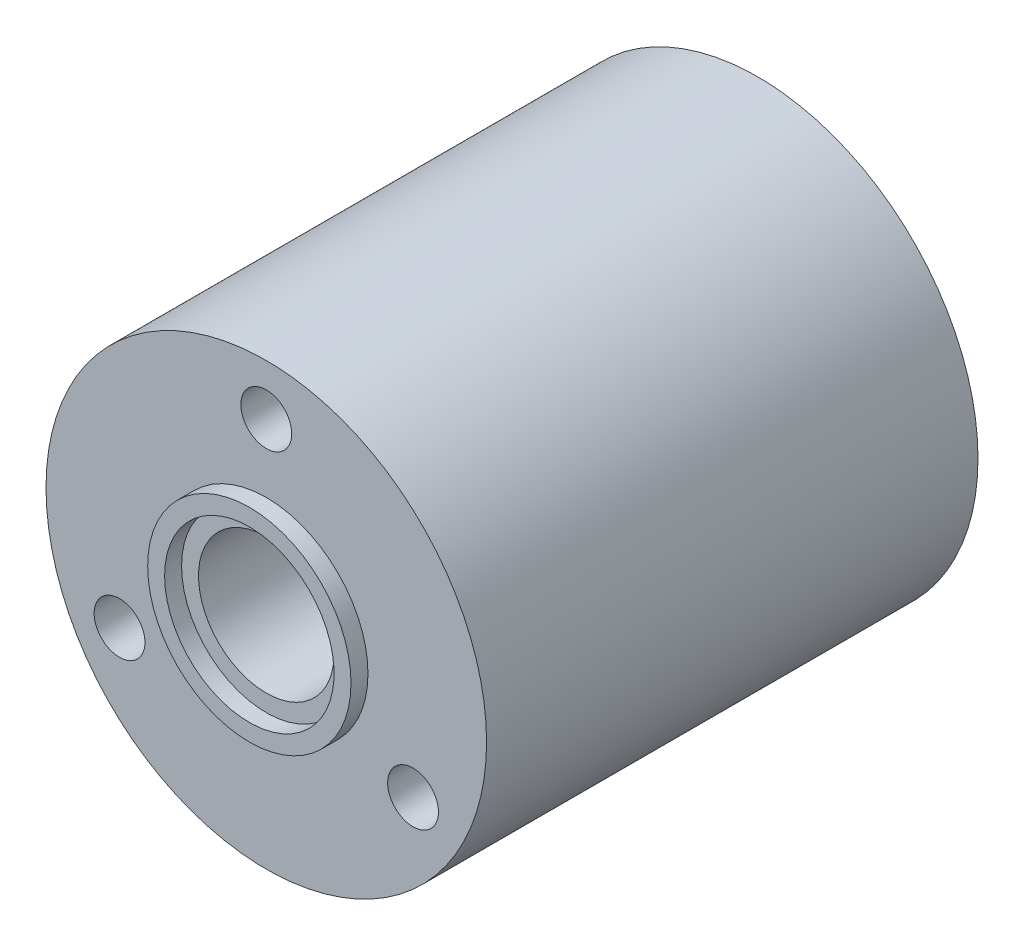
ISO-10303-21;
HEADER;
FILE_DESCRIPTION(('STEP AP214'),'2;1');
FILE_NAME('part.step','',(''),(''),'','','');
FILE_SCHEMA(('AUTOMOTIVE_DESIGN { 1 0 10303 214 1 1 1 1 }'));
ENDSEC;
DATA;
#1=APPLICATION_CONTEXT('core data for automotive mechanical design processes');
#2=APPLICATION_PROTOCOL_DEFINITION('international standard','automotive_design',2000,#1);
#3=PRODUCT_CONTEXT('',#1,'mechanical');
#4=PRODUCT('Part','Part','',(#3));
#5=PRODUCT_RELATED_PRODUCT_CATEGORY('part','',(#4));
#6=PRODUCT_DEFINITION_FORMATION('','',#4);
#7=PRODUCT_DEFINITION_CONTEXT('part definition',#1,'design');
#8=PRODUCT_DEFINITION('design','',#6,#7);
#9=PRODUCT_DEFINITION_SHAPE('','',#8);
#10=(LENGTH_UNIT() NAMED_UNIT(*) SI_UNIT(.MILLI.,.METRE.));
#11=(NAMED_UNIT(*) PLANE_ANGLE_UNIT() SI_UNIT($,.RADIAN.));
#12=(NAMED_UNIT(*) SI_UNIT($,.STERADIAN.) SOLID_ANGLE_UNIT());
#13=UNCERTAINTY_MEASURE_WITH_UNIT(LENGTH_MEASURE(1.E-05),#10,'distance_accuracy_value','');
#14=(GEOMETRIC_REPRESENTATION_CONTEXT(3) GLOBAL_UNCERTAINTY_ASSIGNED_CONTEXT((#13)) GLOBAL_UNIT_ASSIGNED_CONTEXT((#10,
#11,#12)) REPRESENTATION_CONTEXT('',''));
#15=CARTESIAN_POINT('',(0.,0.,0.));
#16=DIRECTION('',(0.,0.,1.));
#17=DIRECTION('',(1.,0.,0.));
#18=AXIS2_PLACEMENT_3D('',#15,#16,#17);
#19=CARTESIAN_POINT('',(0.,0.,29.));
#20=DIRECTION('',(0.,0.,-1.));
#21=DIRECTION('',(-1.,0.,0.));
#22=AXIS2_PLACEMENT_3D('',#19,#20,#21);
#23=CYLINDRICAL_SURFACE('',#22,5.);
#24=CARTESIAN_POINT('',(0.,0.,-1.));
#25=DIRECTION('',(0.,0.,1.));
#26=DIRECTION('',(1.,0.,0.));
#27=AXIS2_PLACEMENT_3D('',#24,#25,#26);
#28=CIRCLE('',#27,5.);
#29=CARTESIAN_POINT('',(-5.,0.,-1.));
#30=VERTEX_POINT('',#29);
#31=EDGE_CURVE('E57',#30,#30,#28,.T.);
#32=CARTESIAN_POINT('',(0.,0.,0.));
#33=DIRECTION('',(0.,0.,1.));
#34=DIRECTION('',(1.,0.,0.));
#35=AXIS2_PLACEMENT_3D('',#32,#33,#34);
#36=CIRCLE('',#35,5.);
#37=CARTESIAN_POINT('',(-5.,0.,0.));
#38=VERTEX_POINT('',#37);
#39=EDGE_CURVE('E70',#38,#38,#36,.T.);
#40=CARTESIAN_POINT('',(-5.,0.,-1.));
#41=CARTESIAN_POINT('',(-5.,0.,-0.989583333333334));
#42=CARTESIAN_POINT('',(-5.,0.,-0.979166666666668));
#43=CARTESIAN_POINT('',(-5.,0.,-0.958333333333334));
#44=CARTESIAN_POINT('',(-5.,0.,-0.947916666666668));
#45=CARTESIAN_POINT('',(-5.,0.,-0.927083333333334));
#46=CARTESIAN_POINT('',(-5.,0.,-0.916666666666668));
#47=CARTESIAN_POINT('',(-5.,0.,-0.895833333333334));
#48=CARTESIAN_POINT('',(-5.,0.,-0.885416666666668));
#49=CARTESIAN_POINT('',(-5.,0.,-0.864583333333334));
#50=CARTESIAN_POINT('',(-5.,0.,-0.854166666666667));
#51=CARTESIAN_POINT('',(-5.,0.,-0.833333333333334));
#52=CARTESIAN_POINT('',(-5.,0.,-0.822916666666667));
#53=CARTESIAN_POINT('',(-5.,0.,-0.802083333333334));
#54=CARTESIAN_POINT('',(-5.,0.,-0.791666666666667));
#55=CARTESIAN_POINT('',(-5.,0.,-0.770833333333334));
#56=CARTESIAN_POINT('',(-5.,0.,-0.760416666666667));
#57=CARTESIAN_POINT('',(-5.,0.,-0.739583333333334));
#58=CARTESIAN_POINT('',(-5.,0.,-0.729166666666667));
#59=CARTESIAN_POINT('',(-5.,0.,-0.708333333333334));
#60=CARTESIAN_POINT('',(-5.,0.,-0.697916666666667));
#61=CARTESIAN_POINT('',(-5.,0.,-0.677083333333334));
#62=CARTESIAN_POINT('',(-5.,0.,-0.666666666666667));
#63=CARTESIAN_POINT('',(-5.,0.,-0.645833333333334));
#64=CARTESIAN_POINT('',(-5.,0.,-0.635416666666667));
#65=CARTESIAN_POINT('',(-5.,0.,-0.614583333333334));
#66=CARTESIAN_POINT('',(-5.,0.,-0.604166666666667));
#67=CARTESIAN_POINT('',(-5.,0.,-0.583333333333334));
#68=CARTESIAN_POINT('',(-5.,0.,-0.572916666666667));
#69=CARTESIAN_POINT('',(-5.,0.,-0.552083333333334));
#70=CARTESIAN_POINT('',(-5.,0.,-0.541666666666667));
#71=CARTESIAN_POINT('',(-5.,0.,-0.520833333333334));
#72=CARTESIAN_POINT('',(-5.,0.,-0.510416666666667));
#73=CARTESIAN_POINT('',(-5.,0.,-0.489583333333334));
#74=CARTESIAN_POINT('',(-5.,0.,-0.479166666666667));
#75=CARTESIAN_POINT('',(-5.,0.,-0.458333333333334));
#76=CARTESIAN_POINT('',(-5.,0.,-0.447916666666667));
#77=CARTESIAN_POINT('',(-5.,0.,-0.427083333333334));
#78=CARTESIAN_POINT('',(-5.,0.,-0.416666666666667));
#79=CARTESIAN_POINT('',(-5.,0.,-0.395833333333334));
#80=CARTESIAN_POINT('',(-5.,0.,-0.385416666666667));
#81=CARTESIAN_POINT('',(-5.,0.,-0.364583333333334));
#82=CARTESIAN_POINT('',(-5.,0.,-0.354166666666667));
#83=CARTESIAN_POINT('',(-5.,0.,-0.333333333333334));
#84=CARTESIAN_POINT('',(-5.,0.,-0.322916666666667));
#85=CARTESIAN_POINT('',(-5.,0.,-0.302083333333334));
#86=CARTESIAN_POINT('',(-5.,0.,-0.291666666666667));
#87=CARTESIAN_POINT('',(-5.,0.,-0.270833333333334));
#88=CARTESIAN_POINT('',(-5.,0.,-0.260416666666667));
#89=CARTESIAN_POINT('',(-5.,0.,-0.239583333333334));
#90=CARTESIAN_POINT('',(-5.,0.,-0.229166666666667));
#91=CARTESIAN_POINT('',(-5.,0.,-0.208333333333334));
#92=CARTESIAN_POINT('',(-5.,0.,-0.197916666666667));
#93=CARTESIAN_POINT('',(-5.,0.,-0.177083333333333));
#94=CARTESIAN_POINT('',(-5.,0.,-0.166666666666667));
#95=CARTESIAN_POINT('',(-5.,0.,-0.145833333333333));
#96=CARTESIAN_POINT('',(-5.,0.,-0.135416666666667));
#97=CARTESIAN_POINT('',(-5.,0.,-0.114583333333333));
#98=CARTESIAN_POINT('',(-5.,0.,-0.104166666666667));
#99=CARTESIAN_POINT('',(-5.,0.,-0.0833333333333334));
#100=CARTESIAN_POINT('',(-5.,0.,-0.0729166666666667));
#101=CARTESIAN_POINT('',(-5.,0.,-0.0520833333333334));
#102=CARTESIAN_POINT('',(-5.,0.,-0.0416666666666667));
#103=CARTESIAN_POINT('',(-5.,0.,-0.0208333333333333));
#104=CARTESIAN_POINT('',(-5.,0.,-0.0104166666666667));
#105=CARTESIAN_POINT('',(-5.,0.,0.));
#106=B_SPLINE_CURVE_WITH_KNOTS('',3,(#40,#41,#42,#43,#44,#45,#46,#47,#48,#49,#50,#51,#52,#53,
#54,#55,#56,#57,#58,#59,#60,#61,#62,#63,#64,#65,#66,#67,#68,#69,#70,#71,#72,#73,#74,#75,#76,#77,
#78,#79,#80,#81,#82,#83,#84,#85,#86,#87,#88,#89,#90,#91,#92,#93,#94,#95,#96,#97,#98,#99,#100,
#101,#102,#103,#104,#105),.UNSPECIFIED.,.F.,.F.,(4,2,2,2,2,2,2,2,2,2,2,2,2,2,2,2,2,2,2,2,2,2,2,
2,2,2,2,2,2,2,2,2,4),(0.,0.03125,0.0625000000000001,0.0937500000000001,0.125,0.15625,0.1875,
0.21875,0.25,0.28125,0.3125,0.34375,0.375,0.40625,0.4375,0.46875,0.5,0.53125,0.5625,
0.593750000000001,0.625000000000001,0.656250000000001,0.687500000000001,0.718750000000001,
0.750000000000001,0.781250000000001,0.812500000000001,0.843750000000001,0.875000000000001,
0.906250000000001,0.937500000000001,0.968750000000001,1.),.UNSPECIFIED.);
#107=EDGE_CURVE('BSEAM32',#30,#38,#106,.T.);
#108=ORIENTED_EDGE('',*,*,#31,.F.);
#109=ORIENTED_EDGE('',*,*,#39,.T.);
#110=ORIENTED_EDGE('',*,*,#107,.T.);
#111=ORIENTED_EDGE('',*,*,#107,.F.);
#112=EDGE_LOOP('',(#108,#110,#109,#111));
#113=FACE_BOUND('',#112,.T.);
#114=ADVANCED_FACE('F32',(#113),#23,.F.);
#115=CARTESIAN_POINT('',(0.,0.,29.));
#116=DIRECTION('',(0.,0.,1.));
#117=DIRECTION('',(1.,0.,0.));
#118=AXIS2_PLACEMENT_3D('',#115,#116,#117);
#119=PLANE('',#118);
#120=CARTESIAN_POINT('',(-8.66025403784375,-5.00000000000037,29.));
#121=DIRECTION('',(0.,0.,1.));
#122=DIRECTION('',(1.,0.,0.));
#123=AXIS2_PLACEMENT_3D('',#120,#121,#122);
#124=CIRCLE('',#123,1.50000000000081);
#125=CARTESIAN_POINT('',(-7.16025403784294,-5.00000000000037,29.));
#126=VERTEX_POINT('',#125);
#127=EDGE_CURVE('E64',#126,#126,#124,.T.);
#128=ORIENTED_EDGE('',*,*,#127,.F.);
#129=EDGE_LOOP('',(#128));
#130=FACE_BOUND('',#129,.T.);
#131=CARTESIAN_POINT('',(8.66025403784503,-4.99999999999963,29.));
#132=DIRECTION('',(0.,0.,1.));
#133=DIRECTION('',(1.,0.,0.));
#134=AXIS2_PLACEMENT_3D('',#131,#132,#133);
#135=CIRCLE('',#134,1.50000000000055);
#136=CARTESIAN_POINT('',(10.1602540378456,-4.99999999999963,29.));
#137=VERTEX_POINT('',#136);
#138=EDGE_CURVE('E61',#137,#137,#135,.T.);
#139=ORIENTED_EDGE('',*,*,#138,.F.);
#140=EDGE_LOOP('',(#139));
#141=FACE_BOUND('',#140,.T.);
#142=CARTESIAN_POINT('',(0.,10.,29.));
#143=DIRECTION('',(0.,0.,1.));
#144=DIRECTION('',(1.,0.,0.));
#145=AXIS2_PLACEMENT_3D('',#142,#143,#144);
#146=CIRCLE('',#145,1.5);
#147=CARTESIAN_POINT('',(1.5,10.,29.));
#148=VERTEX_POINT('',#147);
#149=EDGE_CURVE('E58',#148,#148,#146,.T.);
#150=ORIENTED_EDGE('',*,*,#149,.F.);
#151=EDGE_LOOP('',(#150));
#152=FACE_BOUND('',#151,.T.);
#153=CARTESIAN_POINT('',(0.,0.,29.));
#154=DIRECTION('',(0.,0.,1.));
#155=DIRECTION('',(1.,0.,0.));
#156=AXIS2_PLACEMENT_3D('',#153,#154,#155);
#157=CIRCLE('',#156,13.);
#158=CARTESIAN_POINT('',(-13.,0.,29.));
#159=VERTEX_POINT('',#158);
#160=EDGE_CURVE('E39',#159,#159,#157,.T.);
#161=ORIENTED_EDGE('',*,*,#160,.T.);
#162=EDGE_LOOP('',(#161));
#163=FACE_BOUND('',#162,.T.);
#164=CARTESIAN_POINT('',(0.,0.,29.));
#165=DIRECTION('',(0.,0.,1.));
#166=DIRECTION('',(1.,0.,0.));
#167=AXIS2_PLACEMENT_3D('',#164,#165,#166);
#168=CIRCLE('',#167,6.);
#169=CARTESIAN_POINT('',(6.,0.,29.));
#170=VERTEX_POINT('',#169);
#171=EDGE_CURVE('E51',#170,#170,#168,.T.);
#172=ORIENTED_EDGE('',*,*,#171,.F.);
#173=EDGE_LOOP('',(#172));
#174=FACE_BOUND('',#173,.T.);
#175=ADVANCED_FACE('F99',(#130,#141,#152,#163,#174),#119,.T.);
#176=CARTESIAN_POINT('',(0.,0.,0.));
#177=DIRECTION('',(0.,0.,1.));
#178=DIRECTION('',(1.,0.,0.));
#179=AXIS2_PLACEMENT_3D('',#176,#177,#178);
#180=PLANE('',#179);
#181=CARTESIAN_POINT('',(-8.66025403784375,-5.00000000000037,0.));
#182=DIRECTION('',(0.,0.,1.));
#183=DIRECTION('',(1.,0.,0.));
#184=AXIS2_PLACEMENT_3D('',#181,#182,#183);
#185=CIRCLE('',#184,1.50000000000081);
#186=CARTESIAN_POINT('',(-7.16025403784294,-5.00000000000037,0.));
#187=VERTEX_POINT('',#186);
#188=EDGE_CURVE('E62',#187,#187,#185,.T.);
#189=ORIENTED_EDGE('',*,*,#188,.T.);
#190=EDGE_LOOP('',(#189));
#191=FACE_BOUND('',#190,.T.);
#192=CARTESIAN_POINT('',(8.66025403784503,-4.99999999999963,0.));
#193=DIRECTION('',(0.,0.,1.));
#194=DIRECTION('',(1.,0.,0.));
#195=AXIS2_PLACEMENT_3D('',#192,#193,#194);
#196=CIRCLE('',#195,1.50000000000055);
#197=CARTESIAN_POINT('',(10.1602540378456,-4.99999999999963,0.));
#198=VERTEX_POINT('',#197);
#199=EDGE_CURVE('E59',#198,#198,#196,.T.);
#200=ORIENTED_EDGE('',*,*,#199,.T.);
#201=EDGE_LOOP('',(#200));
#202=FACE_BOUND('',#201,.T.);
#203=CARTESIAN_POINT('',(0.,10.,0.));
#204=DIRECTION('',(0.,0.,1.));
#205=DIRECTION('',(1.,0.,0.));
#206=AXIS2_PLACEMENT_3D('',#203,#204,#205);
#207=CIRCLE('',#206,1.5);
#208=CARTESIAN_POINT('',(1.5,10.,0.));
#209=VERTEX_POINT('',#208);
#210=EDGE_CURVE('E54',#209,#209,#207,.T.);
#211=ORIENTED_EDGE('',*,*,#210,.T.);
#212=EDGE_LOOP('',(#211));
#213=FACE_BOUND('',#212,.T.);
#214=CARTESIAN_POINT('',(0.,0.,0.));
#215=DIRECTION('',(0.,0.,1.));
#216=DIRECTION('',(1.,0.,0.));
#217=AXIS2_PLACEMENT_3D('',#214,#215,#216);
#218=CIRCLE('',#217,6.);
#219=CARTESIAN_POINT('',(6.,0.,0.));
#220=VERTEX_POINT('',#219);
#221=EDGE_CURVE('E83',#220,#220,#218,.T.);
#222=ORIENTED_EDGE('',*,*,#221,.T.);
#223=EDGE_LOOP('',(#222));
#224=FACE_BOUND('',#223,.T.);
#225=CARTESIAN_POINT('',(0.,0.,0.));
#226=DIRECTION('',(0.,0.,1.));
#227=DIRECTION('',(1.,0.,0.));
#228=AXIS2_PLACEMENT_3D('',#225,#226,#227);
#229=CIRCLE('',#228,13.);
#230=CARTESIAN_POINT('',(-13.,0.,0.));
#231=VERTEX_POINT('',#230);
#232=EDGE_CURVE('E43',#231,#231,#229,.T.);
#233=ORIENTED_EDGE('',*,*,#232,.F.);
#234=EDGE_LOOP('',(#233));
#235=FACE_BOUND('',#234,.T.);
#236=ADVANCED_FACE('F101',(#191,#202,#213,#224,#235),#180,.F.);
#237=CARTESIAN_POINT('',(0.,0.,29.));
#238=DIRECTION('',(0.,0.,-1.));
#239=DIRECTION('',(-1.,0.,0.));
#240=AXIS2_PLACEMENT_3D('',#237,#238,#239);
#241=CYLINDRICAL_SURFACE('',#240,13.);
#242=CARTESIAN_POINT('',(-13.,0.,29.));
#243=CARTESIAN_POINT('',(-13.,0.,28.6979166666667));
#244=CARTESIAN_POINT('',(-13.,0.,28.3958333333333));
#245=CARTESIAN_POINT('',(-13.,0.,27.7916666666667));
#246=CARTESIAN_POINT('',(-13.,0.,27.4895833333333));
#247=CARTESIAN_POINT('',(-13.,0.,26.8854166666667));
#248=CARTESIAN_POINT('',(-13.,0.,26.5833333333333));
#249=CARTESIAN_POINT('',(-13.,0.,25.9791666666667));
#250=CARTESIAN_POINT('',(-13.,0.,25.6770833333333));
#251=CARTESIAN_POINT('',(-13.,0.,25.0729166666667));
#252=CARTESIAN_POINT('',(-13.,0.,24.7708333333333));
#253=CARTESIAN_POINT('',(-13.,0.,24.1666666666667));
#254=CARTESIAN_POINT('',(-13.,0.,23.8645833333333));
#255=CARTESIAN_POINT('',(-13.,0.,23.2604166666667));
#256=CARTESIAN_POINT('',(-13.,0.,22.9583333333333));
#257=CARTESIAN_POINT('',(-13.,0.,22.3541666666667));
#258=CARTESIAN_POINT('',(-13.,0.,22.0520833333333));
#259=CARTESIAN_POINT('',(-13.,0.,21.4479166666667));
#260=CARTESIAN_POINT('',(-13.,0.,21.1458333333333));
#261=CARTESIAN_POINT('',(-13.,0.,20.5416666666667));
#262=CARTESIAN_POINT('',(-13.,0.,20.2395833333333));
#263=CARTESIAN_POINT('',(-13.,0.,19.6354166666667));
#264=CARTESIAN_POINT('',(-13.,0.,19.3333333333333));
#265=CARTESIAN_POINT('',(-13.,0.,18.7291666666667));
#266=CARTESIAN_POINT('',(-13.,0.,18.4270833333333));
#267=CARTESIAN_POINT('',(-13.,0.,17.8229166666667));
#268=CARTESIAN_POINT('',(-13.,0.,17.5208333333333));
#269=CARTESIAN_POINT('',(-13.,0.,16.9166666666667));
#270=CARTESIAN_POINT('',(-13.,0.,16.6145833333333));
#271=CARTESIAN_POINT('',(-13.,0.,16.0104166666667));
#272=CARTESIAN_POINT('',(-13.,0.,15.7083333333333));
#273=CARTESIAN_POINT('',(-13.,0.,15.1041666666667));
#274=CARTESIAN_POINT('',(-13.,0.,14.8020833333333));
#275=CARTESIAN_POINT('',(-13.,0.,14.1979166666667));
#276=CARTESIAN_POINT('',(-13.,0.,13.8958333333333));
#277=CARTESIAN_POINT('',(-13.,0.,13.2916666666667));
#278=CARTESIAN_POINT('',(-13.,0.,12.9895833333333));
#279=CARTESIAN_POINT('',(-13.,0.,12.3854166666667));
#280=CARTESIAN_POINT('',(-13.,0.,12.0833333333333));
#281=CARTESIAN_POINT('',(-13.,0.,11.4791666666667));
#282=CARTESIAN_POINT('',(-13.,0.,11.1770833333333));
#283=CARTESIAN_POINT('',(-13.,0.,10.5729166666667));
#284=CARTESIAN_POINT('',(-13.,0.,10.2708333333333));
#285=CARTESIAN_POINT('',(-13.,0.,9.66666666666667));
#286=CARTESIAN_POINT('',(-13.,0.,9.36458333333333));
#287=CARTESIAN_POINT('',(-13.,0.,8.76041666666667));
#288=CARTESIAN_POINT('',(-13.,0.,8.45833333333333));
#289=CARTESIAN_POINT('',(-13.,0.,7.85416666666667));
#290=CARTESIAN_POINT('',(-13.,0.,7.55208333333333));
#291=CARTESIAN_POINT('',(-13.,0.,6.94791666666667));
#292=CARTESIAN_POINT('',(-13.,0.,6.64583333333333));
#293=CARTESIAN_POINT('',(-13.,0.,6.04166666666667));
#294=CARTESIAN_POINT('',(-13.,0.,5.73958333333333));
#295=CARTESIAN_POINT('',(-13.,0.,5.13541666666667));
#296=CARTESIAN_POINT('',(-13.,0.,4.83333333333333));
#297=CARTESIAN_POINT('',(-13.,0.,4.22916666666667));
#298=CARTESIAN_POINT('',(-13.,0.,3.92708333333333));
#299=CARTESIAN_POINT('',(-13.,0.,3.32291666666667));
#300=CARTESIAN_POINT('',(-13.,0.,3.02083333333333));
#301=CARTESIAN_POINT('',(-13.,0.,2.41666666666667));
#302=CARTESIAN_POINT('',(-13.,0.,2.11458333333333));
#303=CARTESIAN_POINT('',(-13.,0.,1.51041666666667));
#304=CARTESIAN_POINT('',(-13.,0.,1.20833333333333));
#305=CARTESIAN_POINT('',(-13.,0.,0.604166666666667));
#306=CARTESIAN_POINT('',(-13.,0.,0.302083333333333));
#307=CARTESIAN_POINT('',(-13.,0.,0.));
#308=B_SPLINE_CURVE_WITH_KNOTS('',3,(#242,#243,#244,#245,#246,#247,#248,#249,#250,#251,#252,
#253,#254,#255,#256,#257,#258,#259,#260,#261,#262,#263,#264,#265,#266,#267,#268,#269,#270,#271,
#272,#273,#274,#275,#276,#277,#278,#279,#280,#281,#282,#283,#284,#285,#286,#287,#288,#289,#290,
#291,#292,#293,#294,#295,#296,#297,#298,#299,#300,#301,#302,#303,#304,#305,#306,#307),
.UNSPECIFIED.,.F.,.F.,(4,2,2,2,2,2,2,2,2,2,2,2,2,2,2,2,2,2,2,2,2,2,2,2,2,2,2,2,2,2,2,2,4),(0.,
0.906250000000001,1.8125,2.71875,3.625,4.53125,5.4375,6.34375,7.25,8.15625,9.0625,9.96875,
10.875,11.78125,12.6875,13.59375,14.5,15.40625,16.3125,17.21875,18.125,19.03125,19.9375,
20.84375,21.75,22.65625,23.5625,24.46875,25.375,26.28125,27.1875,28.09375,29.),.UNSPECIFIED.);
#309=EDGE_CURVE('BSEAM34',#159,#231,#308,.T.);
#310=ORIENTED_EDGE('',*,*,#160,.F.);
#311=ORIENTED_EDGE('',*,*,#232,.T.);
#312=ORIENTED_EDGE('',*,*,#309,.T.);
#313=ORIENTED_EDGE('',*,*,#309,.F.);
#314=EDGE_LOOP('',(#310,#312,#311,#313));
#315=FACE_BOUND('',#314,.T.);
#316=ADVANCED_FACE('F34',(#315),#241,.T.);
#317=CARTESIAN_POINT('',(0.,0.,29.));
#318=DIRECTION('',(0.,0.,1.));
#319=DIRECTION('',(1.,0.,0.));
#320=AXIS2_PLACEMENT_3D('',#317,#318,#319);
#321=CIRCLE('',#320,5.);
#322=CARTESIAN_POINT('',(-5.,0.,29.));
#323=VERTEX_POINT('',#322);
#324=EDGE_CURVE('E10',#323,#323,#321,.T.);
#325=CARTESIAN_POINT('',(0.,0.,30.));
#326=DIRECTION('',(0.,0.,1.));
#327=DIRECTION('',(1.,0.,0.));
#328=AXIS2_PLACEMENT_3D('',#325,#326,#327);
#329=CIRCLE('',#328,5.);
#330=CARTESIAN_POINT('',(-5.,0.,30.));
#331=VERTEX_POINT('',#330);
#332=EDGE_CURVE('E87',#331,#331,#329,.T.);
#333=CARTESIAN_POINT('',(-5.,0.,29.));
#334=CARTESIAN_POINT('',(-5.,0.,29.0104166666667));
#335=CARTESIAN_POINT('',(-5.,0.,29.0208333333333));
#336=CARTESIAN_POINT('',(-5.,0.,29.0416666666667));
#337=CARTESIAN_POINT('',(-5.,0.,29.0520833333333));
#338=CARTESIAN_POINT('',(-5.,0.,29.0729166666667));
#339=CARTESIAN_POINT('',(-5.,0.,29.0833333333333));
#340=CARTESIAN_POINT('',(-5.,0.,29.1041666666667));
#341=CARTESIAN_POINT('',(-5.,0.,29.1145833333333));
#342=CARTESIAN_POINT('',(-5.,0.,29.1354166666667));
#343=CARTESIAN_POINT('',(-5.,0.,29.1458333333333));
#344=CARTESIAN_POINT('',(-5.,0.,29.1666666666667));
#345=CARTESIAN_POINT('',(-5.,0.,29.1770833333333));
#346=CARTESIAN_POINT('',(-5.,0.,29.1979166666667));
#347=CARTESIAN_POINT('',(-5.,0.,29.2083333333333));
#348=CARTESIAN_POINT('',(-5.,0.,29.2291666666667));
#349=CARTESIAN_POINT('',(-5.,0.,29.2395833333333));
#350=CARTESIAN_POINT('',(-5.,0.,29.2604166666667));
#351=CARTESIAN_POINT('',(-5.,0.,29.2708333333333));
#352=CARTESIAN_POINT('',(-5.,0.,29.2916666666667));
#353=CARTESIAN_POINT('',(-5.,0.,29.3020833333333));
#354=CARTESIAN_POINT('',(-5.,0.,29.3229166666667));
#355=CARTESIAN_POINT('',(-5.,0.,29.3333333333333));
#356=CARTESIAN_POINT('',(-5.,0.,29.3541666666667));
#357=CARTESIAN_POINT('',(-5.,0.,29.3645833333333));
#358=CARTESIAN_POINT('',(-5.,0.,29.3854166666667));
#359=CARTESIAN_POINT('',(-5.,0.,29.3958333333333));
#360=CARTESIAN_POINT('',(-5.,0.,29.4166666666667));
#361=CARTESIAN_POINT('',(-5.,0.,29.4270833333333));
#362=CARTESIAN_POINT('',(-5.,0.,29.4479166666667));
#363=CARTESIAN_POINT('',(-5.,0.,29.4583333333333));
#364=CARTESIAN_POINT('',(-5.,0.,29.4791666666667));
#365=CARTESIAN_POINT('',(-5.,0.,29.4895833333333));
#366=CARTESIAN_POINT('',(-5.,0.,29.5104166666667));
#367=CARTESIAN_POINT('',(-5.,0.,29.5208333333333));
#368=CARTESIAN_POINT('',(-5.,0.,29.5416666666667));
#369=CARTESIAN_POINT('',(-5.,0.,29.5520833333333));
#370=CARTESIAN_POINT('',(-5.,0.,29.5729166666667));
#371=CARTESIAN_POINT('',(-5.,0.,29.5833333333333));
#372=CARTESIAN_POINT('',(-5.,0.,29.6041666666667));
#373=CARTESIAN_POINT('',(-5.,0.,29.6145833333333));
#374=CARTESIAN_POINT('',(-5.,0.,29.6354166666667));
#375=CARTESIAN_POINT('',(-5.,0.,29.6458333333333));
#376=CARTESIAN_POINT('',(-5.,0.,29.6666666666667));
#377=CARTESIAN_POINT('',(-5.,0.,29.6770833333333));
#378=CARTESIAN_POINT('',(-5.,0.,29.6979166666667));
#379=CARTESIAN_POINT('',(-5.,0.,29.7083333333333));
#380=CARTESIAN_POINT('',(-5.,0.,29.7291666666667));
#381=CARTESIAN_POINT('',(-5.,0.,29.7395833333333));
#382=CARTESIAN_POINT('',(-5.,0.,29.7604166666667));
#383=CARTESIAN_POINT('',(-5.,0.,29.7708333333333));
#384=CARTESIAN_POINT('',(-5.,0.,29.7916666666667));
#385=CARTESIAN_POINT('',(-5.,0.,29.8020833333333));
#386=CARTESIAN_POINT('',(-5.,0.,29.8229166666667));
#387=CARTESIAN_POINT('',(-5.,0.,29.8333333333333));
#388=CARTESIAN_POINT('',(-5.,0.,29.8541666666667));
#389=CARTESIAN_POINT('',(-5.,0.,29.8645833333333));
#390=CARTESIAN_POINT('',(-5.,0.,29.8854166666667));
#391=CARTESIAN_POINT('',(-5.,0.,29.8958333333333));
#392=CARTESIAN_POINT('',(-5.,0.,29.9166666666667));
#393=CARTESIAN_POINT('',(-5.,0.,29.9270833333333));
#394=CARTESIAN_POINT('',(-5.,0.,29.9479166666667));
#395=CARTESIAN_POINT('',(-5.,0.,29.9583333333333));
#396=CARTESIAN_POINT('',(-5.,0.,29.9791666666667));
#397=CARTESIAN_POINT('',(-5.,0.,29.9895833333333));
#398=CARTESIAN_POINT('',(-5.,0.,30.));
#399=B_SPLINE_CURVE_WITH_KNOTS('',3,(#333,#334,#335,#336,#337,#338,#339,#340,#341,#342,#343,
#344,#345,#346,#347,#348,#349,#350,#351,#352,#353,#354,#355,#356,#357,#358,#359,#360,#361,#362,
#363,#364,#365,#366,#367,#368,#369,#370,#371,#372,#373,#374,#375,#376,#377,#378,#379,#380,#381,
#382,#383,#384,#385,#386,#387,#388,#389,#390,#391,#392,#393,#394,#395,#396,#397,#398),
.UNSPECIFIED.,.F.,.F.,(4,2,2,2,2,2,2,2,2,2,2,2,2,2,2,2,2,2,2,2,2,2,2,2,2,2,2,2,2,2,2,2,4),(0.,
0.0312500000000035,0.0625000000000035,0.0937500000000036,0.125000000000004,0.156250000000004,
0.187500000000004,0.218750000000004,0.250000000000004,0.281250000000004,0.312500000000004,
0.343750000000004,0.375000000000004,0.406250000000004,0.437500000000004,0.468750000000004,
0.500000000000004,0.531250000000004,0.562500000000004,0.593750000000004,0.625000000000004,
0.656250000000004,0.687500000000004,0.718750000000004,0.750000000000004,0.781250000000004,
0.812500000000004,0.843750000000004,0.875000000000004,0.906250000000004,0.937500000000004,
0.968750000000004,1.),.UNSPECIFIED.);
#400=EDGE_CURVE('BSEAM110',#323,#331,#399,.T.);
#401=ORIENTED_EDGE('',*,*,#324,.F.);
#402=ORIENTED_EDGE('',*,*,#332,.T.);
#403=ORIENTED_EDGE('',*,*,#400,.T.);
#404=ORIENTED_EDGE('',*,*,#400,.F.);
#405=EDGE_LOOP('',(#401,#403,#402,#404));
#406=FACE_BOUND('',#405,.T.);
#407=ADVANCED_FACE('F110',(#406),#23,.F.);
#408=CARTESIAN_POINT('',(0.,0.,30.));
#409=DIRECTION('',(0.,0.,1.));
#410=DIRECTION('',(1.,0.,0.));
#411=AXIS2_PLACEMENT_3D('',#408,#409,#410);
#412=PLANE('',#411);
#413=CARTESIAN_POINT('',(0.,0.,30.));
#414=DIRECTION('',(0.,0.,1.));
#415=DIRECTION('',(1.,0.,0.));
#416=AXIS2_PLACEMENT_3D('',#413,#414,#415);
#417=CIRCLE('',#416,6.);
#418=CARTESIAN_POINT('',(6.,0.,30.));
#419=VERTEX_POINT('',#418);
#420=EDGE_CURVE('E48',#419,#419,#417,.T.);
#421=ORIENTED_EDGE('',*,*,#420,.T.);
#422=EDGE_LOOP('',(#421));
#423=FACE_BOUND('',#422,.T.);
#424=ORIENTED_EDGE('',*,*,#332,.F.);
#425=EDGE_LOOP('',(#424));
#426=FACE_BOUND('',#425,.T.);
#427=ADVANCED_FACE('F114',(#423,#426),#412,.T.);
#428=CARTESIAN_POINT('',(0.,0.,30.));
#429=DIRECTION('',(0.,0.,-1.));
#430=DIRECTION('',(-1.,0.,0.));
#431=AXIS2_PLACEMENT_3D('',#428,#429,#430);
#432=CYLINDRICAL_SURFACE('',#431,6.);
#433=ORIENTED_EDGE('',*,*,#420,.F.);
#434=EDGE_LOOP('',(#433));
#435=FACE_BOUND('',#434,.T.);
#436=ORIENTED_EDGE('',*,*,#171,.T.);
#437=EDGE_LOOP('',(#436));
#438=FACE_BOUND('',#437,.T.);
#439=ADVANCED_FACE('F97',(#435,#438),#432,.T.);
#440=CARTESIAN_POINT('',(0.,0.,-1.));
#441=DIRECTION('',(0.,0.,1.));
#442=DIRECTION('',(1.,0.,0.));
#443=AXIS2_PLACEMENT_3D('',#440,#441,#442);
#444=CYLINDRICAL_SURFACE('',#443,6.);
#445=CARTESIAN_POINT('',(0.,0.,-1.));
#446=DIRECTION('',(0.,0.,1.));
#447=DIRECTION('',(1.,0.,0.));
#448=AXIS2_PLACEMENT_3D('',#445,#446,#447);
#449=CIRCLE('',#448,6.);
#450=CARTESIAN_POINT('',(6.,0.,-1.));
#451=VERTEX_POINT('',#450);
#452=EDGE_CURVE('E84',#451,#451,#449,.T.);
#453=ORIENTED_EDGE('',*,*,#452,.T.);
#454=EDGE_LOOP('',(#453));
#455=FACE_BOUND('',#454,.T.);
#456=ORIENTED_EDGE('',*,*,#221,.F.);
#457=EDGE_LOOP('',(#456));
#458=FACE_BOUND('',#457,.T.);
#459=ADVANCED_FACE('F118',(#455,#458),#444,.T.);
#460=CARTESIAN_POINT('',(0.,0.,-1.));
#461=DIRECTION('',(0.,0.,-1.));
#462=DIRECTION('',(1.,0.,0.));
#463=AXIS2_PLACEMENT_3D('',#460,#461,#462);
#464=PLANE('',#463);
#465=ORIENTED_EDGE('',*,*,#31,.T.);
#466=EDGE_LOOP('',(#465));
#467=FACE_BOUND('',#466,.T.);
#468=ORIENTED_EDGE('',*,*,#452,.F.);
#469=EDGE_LOOP('',(#468));
#470=FACE_BOUND('',#469,.T.);
#471=ADVANCED_FACE('F124',(#467,#470),#464,.T.);
#472=CARTESIAN_POINT('',(0.,10.,-1.));
#473=DIRECTION('',(0.,0.,1.));
#474=DIRECTION('',(1.,0.,0.));
#475=AXIS2_PLACEMENT_3D('',#472,#473,#474);
#476=CYLINDRICAL_SURFACE('',#475,1.5);
#477=CARTESIAN_POINT('',(1.5,10.,29.));
#478=CARTESIAN_POINT('',(1.5,10.,28.6979166666667));
#479=CARTESIAN_POINT('',(1.5,10.,28.3958333333333));
#480=CARTESIAN_POINT('',(1.5,10.,27.7916666666667));
#481=CARTESIAN_POINT('',(1.5,10.,27.4895833333333));
#482=CARTESIAN_POINT('',(1.5,10.,26.8854166666667));
#483=CARTESIAN_POINT('',(1.5,10.,26.5833333333333));
#484=CARTESIAN_POINT('',(1.5,10.,25.9791666666667));
#485=CARTESIAN_POINT('',(1.5,10.,25.6770833333333));
#486=CARTESIAN_POINT('',(1.5,10.,25.0729166666667));
#487=CARTESIAN_POINT('',(1.5,10.,24.7708333333333));
#488=CARTESIAN_POINT('',(1.5,10.,24.1666666666667));
#489=CARTESIAN_POINT('',(1.5,10.,23.8645833333333));
#490=CARTESIAN_POINT('',(1.5,10.,23.2604166666667));
#491=CARTESIAN_POINT('',(1.5,10.,22.9583333333333));
#492=CARTESIAN_POINT('',(1.5,10.,22.3541666666667));
#493=CARTESIAN_POINT('',(1.5,10.,22.0520833333333));
#494=CARTESIAN_POINT('',(1.5,10.,21.4479166666667));
#495=CARTESIAN_POINT('',(1.5,10.,21.1458333333333));
#496=CARTESIAN_POINT('',(1.5,10.,20.5416666666667));
#497=CARTESIAN_POINT('',(1.5,10.,20.2395833333333));
#498=CARTESIAN_POINT('',(1.5,10.,19.6354166666667));
#499=CARTESIAN_POINT('',(1.5,10.,19.3333333333333));
#500=CARTESIAN_POINT('',(1.5,10.,18.7291666666667));
#501=CARTESIAN_POINT('',(1.5,10.,18.4270833333333));
#502=CARTESIAN_POINT('',(1.5,10.,17.8229166666667));
#503=CARTESIAN_POINT('',(1.5,10.,17.5208333333333));
#504=CARTESIAN_POINT('',(1.5,10.,16.9166666666667));
#505=CARTESIAN_POINT('',(1.5,10.,16.6145833333333));
#506=CARTESIAN_POINT('',(1.5,10.,16.0104166666667));
#507=CARTESIAN_POINT('',(1.5,10.,15.7083333333333));
#508=CARTESIAN_POINT('',(1.5,10.,15.1041666666667));
#509=CARTESIAN_POINT('',(1.5,10.,14.8020833333333));
#510=CARTESIAN_POINT('',(1.5,10.,14.1979166666667));
#511=CARTESIAN_POINT('',(1.5,10.,13.8958333333333));
#512=CARTESIAN_POINT('',(1.5,10.,13.2916666666667));
#513=CARTESIAN_POINT('',(1.5,10.,12.9895833333333));
#514=CARTESIAN_POINT('',(1.5,10.,12.3854166666667));
#515=CARTESIAN_POINT('',(1.5,10.,12.0833333333333));
#516=CARTESIAN_POINT('',(1.5,10.,11.4791666666667));
#517=CARTESIAN_POINT('',(1.5,10.,11.1770833333333));
#518=CARTESIAN_POINT('',(1.5,10.,10.5729166666667));
#519=CARTESIAN_POINT('',(1.5,10.,10.2708333333333));
#520=CARTESIAN_POINT('',(1.5,10.,9.66666666666667));
#521=CARTESIAN_POINT('',(1.5,10.,9.36458333333333));
#522=CARTESIAN_POINT('',(1.5,10.,8.76041666666667));
#523=CARTESIAN_POINT('',(1.5,10.,8.45833333333333));
#524=CARTESIAN_POINT('',(1.5,10.,7.85416666666667));
#525=CARTESIAN_POINT('',(1.5,10.,7.55208333333333));
#526=CARTESIAN_POINT('',(1.5,10.,6.94791666666667));
#527=CARTESIAN_POINT('',(1.5,10.,6.64583333333333));
#528=CARTESIAN_POINT('',(1.5,10.,6.04166666666667));
#529=CARTESIAN_POINT('',(1.5,10.,5.73958333333333));
#530=CARTESIAN_POINT('',(1.5,10.,5.13541666666667));
#531=CARTESIAN_POINT('',(1.5,10.,4.83333333333333));
#532=CARTESIAN_POINT('',(1.5,10.,4.22916666666667));
#533=CARTESIAN_POINT('',(1.5,10.,3.92708333333333));
#534=CARTESIAN_POINT('',(1.5,10.,3.32291666666667));
#535=CARTESIAN_POINT('',(1.5,10.,3.02083333333333));
#536=CARTESIAN_POINT('',(1.5,10.,2.41666666666667));
#537=CARTESIAN_POINT('',(1.5,10.,2.11458333333333));
#538=CARTESIAN_POINT('',(1.5,10.,1.51041666666667));
#539=CARTESIAN_POINT('',(1.5,10.,1.20833333333333));
#540=CARTESIAN_POINT('',(1.5,10.,0.604166666666667));
#541=CARTESIAN_POINT('',(1.5,10.,0.302083333333334));
#542=CARTESIAN_POINT('',(1.5,10.,0.));
#543=B_SPLINE_CURVE_WITH_KNOTS('',3,(#477,#478,#479,#480,#481,#482,#483,#484,#485,#486,#487,
#488,#489,#490,#491,#492,#493,#494,#495,#496,#497,#498,#499,#500,#501,#502,#503,#504,#505,#506,
#507,#508,#509,#510,#511,#512,#513,#514,#515,#516,#517,#518,#519,#520,#521,#522,#523,#524,#525,
#526,#527,#528,#529,#530,#531,#532,#533,#534,#535,#536,#537,#538,#539,#540,#541,#542),
.UNSPECIFIED.,.F.,.F.,(4,2,2,2,2,2,2,2,2,2,2,2,2,2,2,2,2,2,2,2,2,2,2,2,2,2,2,2,2,2,2,2,4),(0.,
0.906250000000001,1.8125,2.71875,3.625,4.53125,5.4375,6.34375,7.25,8.15625,9.0625,9.96875,
10.875,11.78125,12.6875,13.59375,14.5,15.40625,16.3125,17.21875,18.125,19.03125,19.9375,
20.84375,21.75,22.65625,23.5625,24.46875,25.375,26.28125,27.1875,28.09375,29.),.UNSPECIFIED.);
#544=EDGE_CURVE('BSEAM128',#148,#209,#543,.T.);
#545=ORIENTED_EDGE('',*,*,#149,.T.);
#546=ORIENTED_EDGE('',*,*,#210,.F.);
#547=ORIENTED_EDGE('',*,*,#544,.T.);
#548=ORIENTED_EDGE('',*,*,#544,.F.);
#549=EDGE_LOOP('',(#545,#547,#546,#548));
#550=FACE_BOUND('',#549,.T.);
#551=ADVANCED_FACE('F128',(#550),#476,.F.);
#552=CARTESIAN_POINT('',(8.66025403784503,-4.99999999999963,-1.));
#553=DIRECTION('',(0.,0.,1.));
#554=DIRECTION('',(1.,0.,0.));
#555=AXIS2_PLACEMENT_3D('',#552,#553,#554);
#556=CYLINDRICAL_SURFACE('',#555,1.50000000000055);
#557=CARTESIAN_POINT('',(10.1602540378456,-4.99999999999963,29.));
#558=CARTESIAN_POINT('',(10.1602540378456,-4.99999999999963,28.6979166666667));
#559=CARTESIAN_POINT('',(10.1602540378456,-4.99999999999963,28.3958333333333));
#560=CARTESIAN_POINT('',(10.1602540378456,-4.99999999999963,27.7916666666667));
#561=CARTESIAN_POINT('',(10.1602540378456,-4.99999999999963,27.4895833333333));
#562=CARTESIAN_POINT('',(10.1602540378456,-4.99999999999963,26.8854166666667));
#563=CARTESIAN_POINT('',(10.1602540378456,-4.99999999999963,26.5833333333333));
#564=CARTESIAN_POINT('',(10.1602540378456,-4.99999999999963,25.9791666666667));
#565=CARTESIAN_POINT('',(10.1602540378456,-4.99999999999963,25.6770833333333));
#566=CARTESIAN_POINT('',(10.1602540378456,-4.99999999999963,25.0729166666667));
#567=CARTESIAN_POINT('',(10.1602540378456,-4.99999999999963,24.7708333333333));
#568=CARTESIAN_POINT('',(10.1602540378456,-4.99999999999963,24.1666666666667));
#569=CARTESIAN_POINT('',(10.1602540378456,-4.99999999999963,23.8645833333333));
#570=CARTESIAN_POINT('',(10.1602540378456,-4.99999999999963,23.2604166666667));
#571=CARTESIAN_POINT('',(10.1602540378456,-4.99999999999963,22.9583333333333));
#572=CARTESIAN_POINT('',(10.1602540378456,-4.99999999999963,22.3541666666667));
#573=CARTESIAN_POINT('',(10.1602540378456,-4.99999999999963,22.0520833333333));
#574=CARTESIAN_POINT('',(10.1602540378456,-4.99999999999963,21.4479166666667));
#575=CARTESIAN_POINT('',(10.1602540378456,-4.99999999999963,21.1458333333333));
#576=CARTESIAN_POINT('',(10.1602540378456,-4.99999999999963,20.5416666666667));
#577=CARTESIAN_POINT('',(10.1602540378456,-4.99999999999963,20.2395833333333));
#578=CARTESIAN_POINT('',(10.1602540378456,-4.99999999999963,19.6354166666667));
#579=CARTESIAN_POINT('',(10.1602540378456,-4.99999999999963,19.3333333333333));
#580=CARTESIAN_POINT('',(10.1602540378456,-4.99999999999963,18.7291666666667));
#581=CARTESIAN_POINT('',(10.1602540378456,-4.99999999999963,18.4270833333333));
#582=CARTESIAN_POINT('',(10.1602540378456,-4.99999999999963,17.8229166666667));
#583=CARTESIAN_POINT('',(10.1602540378456,-4.99999999999963,17.5208333333333));
#584=CARTESIAN_POINT('',(10.1602540378456,-4.99999999999963,16.9166666666667));
#585=CARTESIAN_POINT('',(10.1602540378456,-4.99999999999963,16.6145833333333));
#586=CARTESIAN_POINT('',(10.1602540378456,-4.99999999999963,16.0104166666667));
#587=CARTESIAN_POINT('',(10.1602540378456,-4.99999999999963,15.7083333333333));
#588=CARTESIAN_POINT('',(10.1602540378456,-4.99999999999963,15.1041666666667));
#589=CARTESIAN_POINT('',(10.1602540378456,-4.99999999999963,14.8020833333333));
#590=CARTESIAN_POINT('',(10.1602540378456,-4.99999999999963,14.1979166666667));
#591=CARTESIAN_POINT('',(10.1602540378456,-4.99999999999963,13.8958333333333));
#592=CARTESIAN_POINT('',(10.1602540378456,-4.99999999999963,13.2916666666667));
#593=CARTESIAN_POINT('',(10.1602540378456,-4.99999999999963,12.9895833333333));
#594=CARTESIAN_POINT('',(10.1602540378456,-4.99999999999963,12.3854166666667));
#595=CARTESIAN_POINT('',(10.1602540378456,-4.99999999999963,12.0833333333333));
#596=CARTESIAN_POINT('',(10.1602540378456,-4.99999999999963,11.4791666666667));
#597=CARTESIAN_POINT('',(10.1602540378456,-4.99999999999963,11.1770833333333));
#598=CARTESIAN_POINT('',(10.1602540378456,-4.99999999999963,10.5729166666667));
#599=CARTESIAN_POINT('',(10.1602540378456,-4.99999999999963,10.2708333333333));
#600=CARTESIAN_POINT('',(10.1602540378456,-4.99999999999963,9.66666666666667));
#601=CARTESIAN_POINT('',(10.1602540378456,-4.99999999999963,9.36458333333333));
#602=CARTESIAN_POINT('',(10.1602540378456,-4.99999999999963,8.76041666666667));
#603=CARTESIAN_POINT('',(10.1602540378456,-4.99999999999963,8.45833333333333));
#604=CARTESIAN_POINT('',(10.1602540378456,-4.99999999999963,7.85416666666667));
#605=CARTESIAN_POINT('',(10.1602540378456,-4.99999999999963,7.55208333333333));
#606=CARTESIAN_POINT('',(10.1602540378456,-4.99999999999963,6.94791666666667));
#607=CARTESIAN_POINT('',(10.1602540378456,-4.99999999999963,6.64583333333333));
#608=CARTESIAN_POINT('',(10.1602540378456,-4.99999999999963,6.04166666666667));
#609=CARTESIAN_POINT('',(10.1602540378456,-4.99999999999963,5.73958333333333));
#610=CARTESIAN_POINT('',(10.1602540378456,-4.99999999999963,5.13541666666667));
#611=CARTESIAN_POINT('',(10.1602540378456,-4.99999999999963,4.83333333333333));
#612=CARTESIAN_POINT('',(10.1602540378456,-4.99999999999963,4.22916666666667));
#613=CARTESIAN_POINT('',(10.1602540378456,-4.99999999999963,3.92708333333333));
#614=CARTESIAN_POINT('',(10.1602540378456,-4.99999999999963,3.32291666666667));
#615=CARTESIAN_POINT('',(10.1602540378456,-4.99999999999963,3.02083333333333));
#616=CARTESIAN_POINT('',(10.1602540378456,-4.99999999999963,2.41666666666667));
#617=CARTESIAN_POINT('',(10.1602540378456,-4.99999999999963,2.11458333333333));
#618=CARTESIAN_POINT('',(10.1602540378456,-4.99999999999963,1.51041666666667));
#619=CARTESIAN_POINT('',(10.1602540378456,-4.99999999999963,1.20833333333333));
#620=CARTESIAN_POINT('',(10.1602540378456,-4.99999999999963,0.604166666666667));
#621=CARTESIAN_POINT('',(10.1602540378456,-4.99999999999963,0.302083333333334));
#622=CARTESIAN_POINT('',(10.1602540378456,-4.99999999999963,0.));
#623=B_SPLINE_CURVE_WITH_KNOTS('',3,(#557,#558,#559,#560,#561,#562,#563,#564,#565,#566,#567,
#568,#569,#570,#571,#572,#573,#574,#575,#576,#577,#578,#579,#580,#581,#582,#583,#584,#585,#586,
#587,#588,#589,#590,#591,#592,#593,#594,#595,#596,#597,#598,#599,#600,#601,#602,#603,#604,#605,
#606,#607,#608,#609,#610,#611,#612,#613,#614,#615,#616,#617,#618,#619,#620,#621,#622),
.UNSPECIFIED.,.F.,.F.,(4,2,2,2,2,2,2,2,2,2,2,2,2,2,2,2,2,2,2,2,2,2,2,2,2,2,2,2,2,2,2,2,4),(0.,
0.906250000000001,1.8125,2.71875,3.625,4.53125,5.4375,6.34375,7.25,8.15625,9.0625,9.96875,
10.875,11.78125,12.6875,13.59375,14.5,15.40625,16.3125,17.21875,18.125,19.03125,19.9375,
20.84375,21.75,22.65625,23.5625,24.46875,25.375,26.28125,27.1875,28.09375,29.),.UNSPECIFIED.);
#624=EDGE_CURVE('BSEAM132',#137,#198,#623,.T.);
#625=ORIENTED_EDGE('',*,*,#138,.T.);
#626=ORIENTED_EDGE('',*,*,#199,.F.);
#627=ORIENTED_EDGE('',*,*,#624,.T.);
#628=ORIENTED_EDGE('',*,*,#624,.F.);
#629=EDGE_LOOP('',(#625,#627,#626,#628));
#630=FACE_BOUND('',#629,.T.);
#631=ADVANCED_FACE('F132',(#630),#556,.F.);
#632=CARTESIAN_POINT('',(-8.66025403784375,-5.00000000000037,-1.));
#633=DIRECTION('',(0.,0.,1.));
#634=DIRECTION('',(1.,0.,0.));
#635=AXIS2_PLACEMENT_3D('',#632,#633,#634);
#636=CYLINDRICAL_SURFACE('',#635,1.50000000000081);
#637=CARTESIAN_POINT('',(-7.16025403784294,-5.00000000000037,29.));
#638=CARTESIAN_POINT('',(-7.16025403784294,-5.00000000000037,28.6979166666667));
#639=CARTESIAN_POINT('',(-7.16025403784294,-5.00000000000037,28.3958333333333));
#640=CARTESIAN_POINT('',(-7.16025403784294,-5.00000000000037,27.7916666666667));
#641=CARTESIAN_POINT('',(-7.16025403784294,-5.00000000000037,27.4895833333333));
#642=CARTESIAN_POINT('',(-7.16025403784294,-5.00000000000037,26.8854166666667));
#643=CARTESIAN_POINT('',(-7.16025403784294,-5.00000000000037,26.5833333333333));
#644=CARTESIAN_POINT('',(-7.16025403784294,-5.00000000000037,25.9791666666667));
#645=CARTESIAN_POINT('',(-7.16025403784294,-5.00000000000037,25.6770833333333));
#646=CARTESIAN_POINT('',(-7.16025403784294,-5.00000000000037,25.0729166666667));
#647=CARTESIAN_POINT('',(-7.16025403784294,-5.00000000000037,24.7708333333333));
#648=CARTESIAN_POINT('',(-7.16025403784294,-5.00000000000037,24.1666666666667));
#649=CARTESIAN_POINT('',(-7.16025403784294,-5.00000000000037,23.8645833333333));
#650=CARTESIAN_POINT('',(-7.16025403784294,-5.00000000000037,23.2604166666667));
#651=CARTESIAN_POINT('',(-7.16025403784294,-5.00000000000037,22.9583333333333));
#652=CARTESIAN_POINT('',(-7.16025403784294,-5.00000000000037,22.3541666666667));
#653=CARTESIAN_POINT('',(-7.16025403784294,-5.00000000000037,22.0520833333333));
#654=CARTESIAN_POINT('',(-7.16025403784294,-5.00000000000037,21.4479166666667));
#655=CARTESIAN_POINT('',(-7.16025403784294,-5.00000000000037,21.1458333333333));
#656=CARTESIAN_POINT('',(-7.16025403784294,-5.00000000000037,20.5416666666667));
#657=CARTESIAN_POINT('',(-7.16025403784294,-5.00000000000037,20.2395833333333));
#658=CARTESIAN_POINT('',(-7.16025403784294,-5.00000000000037,19.6354166666667));
#659=CARTESIAN_POINT('',(-7.16025403784294,-5.00000000000037,19.3333333333333));
#660=CARTESIAN_POINT('',(-7.16025403784294,-5.00000000000037,18.7291666666667));
#661=CARTESIAN_POINT('',(-7.16025403784294,-5.00000000000037,18.4270833333333));
#662=CARTESIAN_POINT('',(-7.16025403784294,-5.00000000000037,17.8229166666667));
#663=CARTESIAN_POINT('',(-7.16025403784294,-5.00000000000037,17.5208333333333));
#664=CARTESIAN_POINT('',(-7.16025403784294,-5.00000000000037,16.9166666666667));
#665=CARTESIAN_POINT('',(-7.16025403784294,-5.00000000000037,16.6145833333333));
#666=CARTESIAN_POINT('',(-7.16025403784294,-5.00000000000037,16.0104166666667));
#667=CARTESIAN_POINT('',(-7.16025403784294,-5.00000000000037,15.7083333333333));
#668=CARTESIAN_POINT('',(-7.16025403784294,-5.00000000000037,15.1041666666667));
#669=CARTESIAN_POINT('',(-7.16025403784294,-5.00000000000037,14.8020833333333));
#670=CARTESIAN_POINT('',(-7.16025403784294,-5.00000000000037,14.1979166666667));
#671=CARTESIAN_POINT('',(-7.16025403784294,-5.00000000000037,13.8958333333333));
#672=CARTESIAN_POINT('',(-7.16025403784294,-5.00000000000037,13.2916666666667));
#673=CARTESIAN_POINT('',(-7.16025403784294,-5.00000000000037,12.9895833333333));
#674=CARTESIAN_POINT('',(-7.16025403784294,-5.00000000000037,12.3854166666667));
#675=CARTESIAN_POINT('',(-7.16025403784294,-5.00000000000037,12.0833333333333));
#676=CARTESIAN_POINT('',(-7.16025403784294,-5.00000000000037,11.4791666666667));
#677=CARTESIAN_POINT('',(-7.16025403784294,-5.00000000000037,11.1770833333333));
#678=CARTESIAN_POINT('',(-7.16025403784294,-5.00000000000037,10.5729166666667));
#679=CARTESIAN_POINT('',(-7.16025403784294,-5.00000000000037,10.2708333333333));
#680=CARTESIAN_POINT('',(-7.16025403784294,-5.00000000000037,9.66666666666667));
#681=CARTESIAN_POINT('',(-7.16025403784294,-5.00000000000037,9.36458333333333));
#682=CARTESIAN_POINT('',(-7.16025403784294,-5.00000000000037,8.76041666666667));
#683=CARTESIAN_POINT('',(-7.16025403784294,-5.00000000000037,8.45833333333333));
#684=CARTESIAN_POINT('',(-7.16025403784294,-5.00000000000037,7.85416666666667));
#685=CARTESIAN_POINT('',(-7.16025403784294,-5.00000000000037,7.55208333333333));
#686=CARTESIAN_POINT('',(-7.16025403784294,-5.00000000000037,6.94791666666667));
#687=CARTESIAN_POINT('',(-7.16025403784294,-5.00000000000037,6.64583333333333));
#688=CARTESIAN_POINT('',(-7.16025403784294,-5.00000000000037,6.04166666666667));
#689=CARTESIAN_POINT('',(-7.16025403784294,-5.00000000000037,5.73958333333333));
#690=CARTESIAN_POINT('',(-7.16025403784294,-5.00000000000037,5.13541666666667));
#691=CARTESIAN_POINT('',(-7.16025403784294,-5.00000000000037,4.83333333333333));
#692=CARTESIAN_POINT('',(-7.16025403784294,-5.00000000000037,4.22916666666667));
#693=CARTESIAN_POINT('',(-7.16025403784294,-5.00000000000037,3.92708333333333));
#694=CARTESIAN_POINT('',(-7.16025403784294,-5.00000000000037,3.32291666666667));
#695=CARTESIAN_POINT('',(-7.16025403784294,-5.00000000000037,3.02083333333333));
#696=CARTESIAN_POINT('',(-7.16025403784294,-5.00000000000037,2.41666666666667));
#697=CARTESIAN_POINT('',(-7.16025403784294,-5.00000000000037,2.11458333333333));
#698=CARTESIAN_POINT('',(-7.16025403784294,-5.00000000000037,1.51041666666667));
#699=CARTESIAN_POINT('',(-7.16025403784294,-5.00000000000037,1.20833333333333));
#700=CARTESIAN_POINT('',(-7.16025403784294,-5.00000000000037,0.604166666666667));
#701=CARTESIAN_POINT('',(-7.16025403784294,-5.00000000000037,0.302083333333334));
#702=CARTESIAN_POINT('',(-7.16025403784294,-5.00000000000037,0.));
#703=B_SPLINE_CURVE_WITH_KNOTS('',3,(#637,#638,#639,#640,#641,#642,#643,#644,#645,#646,#647,
#648,#649,#650,#651,#652,#653,#654,#655,#656,#657,#658,#659,#660,#661,#662,#663,#664,#665,#666,
#667,#668,#669,#670,#671,#672,#673,#674,#675,#676,#677,#678,#679,#680,#681,#682,#683,#684,#685,
#686,#687,#688,#689,#690,#691,#692,#693,#694,#695,#696,#697,#698,#699,#700,#701,#702),
.UNSPECIFIED.,.F.,.F.,(4,2,2,2,2,2,2,2,2,2,2,2,2,2,2,2,2,2,2,2,2,2,2,2,2,2,2,2,2,2,2,2,4),(0.,
0.906250000000001,1.8125,2.71875,3.625,4.53125,5.4375,6.34375,7.25,8.15625,9.0625,9.96875,
10.875,11.78125,12.6875,13.59375,14.5,15.40625,16.3125,17.21875,18.125,19.03125,19.9375,
20.84375,21.75,22.65625,23.5625,24.46875,25.375,26.28125,27.1875,28.09375,29.),.UNSPECIFIED.);
#704=EDGE_CURVE('BSEAM136',#126,#187,#703,.T.);
#705=ORIENTED_EDGE('',*,*,#127,.T.);
#706=ORIENTED_EDGE('',*,*,#188,.F.);
#707=ORIENTED_EDGE('',*,*,#704,.T.);
#708=ORIENTED_EDGE('',*,*,#704,.F.);
#709=EDGE_LOOP('',(#705,#707,#706,#708));
#710=FACE_BOUND('',#709,.T.);
#711=ADVANCED_FACE('F136',(#710),#636,.F.);
#712=CARTESIAN_POINT('',(0.,0.,0.));
#713=DIRECTION('',(0.,0.,1.));
#714=DIRECTION('',(1.,0.,0.));
#715=AXIS2_PLACEMENT_3D('',#712,#713,#714);
#716=PLANE('',#715);
#717=CARTESIAN_POINT('',(0.,0.,0.));
#718=DIRECTION('',(0.,0.,1.));
#719=DIRECTION('',(1.,0.,0.));
#720=AXIS2_PLACEMENT_3D('',#717,#718,#719);
#721=CIRCLE('',#720,4.);
#722=CARTESIAN_POINT('',(4.,0.,0.));
#723=VERTEX_POINT('',#722);
#724=EDGE_CURVE('E75',#723,#723,#721,.T.);
#725=ORIENTED_EDGE('',*,*,#724,.T.);
#726=EDGE_LOOP('',(#725));
#727=FACE_BOUND('',#726,.T.);
#728=ORIENTED_EDGE('',*,*,#39,.F.);
#729=EDGE_LOOP('',(#728));
#730=FACE_BOUND('',#729,.T.);
#731=ADVANCED_FACE('F140',(#727,#730),#716,.F.);
#732=CARTESIAN_POINT('',(0.,0.,29.));
#733=DIRECTION('',(0.,0.,1.));
#734=DIRECTION('',(1.,0.,0.));
#735=AXIS2_PLACEMENT_3D('',#732,#733,#734);
#736=PLANE('',#735);
#737=CARTESIAN_POINT('',(0.,0.,29.));
#738=DIRECTION('',(0.,0.,1.));
#739=DIRECTION('',(1.,0.,0.));
#740=AXIS2_PLACEMENT_3D('',#737,#738,#739);
#741=CIRCLE('',#740,4.);
#742=CARTESIAN_POINT('',(4.,0.,29.));
#743=VERTEX_POINT('',#742);
#744=EDGE_CURVE('E158',#743,#743,#741,.T.);
#745=ORIENTED_EDGE('',*,*,#744,.F.);
#746=EDGE_LOOP('',(#745));
#747=FACE_BOUND('',#746,.T.);
#748=ORIENTED_EDGE('',*,*,#324,.T.);
#749=EDGE_LOOP('',(#748));
#750=FACE_BOUND('',#749,.T.);
#751=ADVANCED_FACE('F141',(#747,#750),#736,.T.);
#752=CARTESIAN_POINT('',(0.,0.,0.));
#753=DIRECTION('',(0.,0.,1.));
#754=DIRECTION('',(1.,0.,0.));
#755=AXIS2_PLACEMENT_3D('',#752,#753,#754);
#756=CYLINDRICAL_SURFACE('',#755,4.);
#757=CARTESIAN_POINT('',(4.,0.,0.));
#758=CARTESIAN_POINT('',(4.,0.,0.302083333333333));
#759=CARTESIAN_POINT('',(4.,0.,0.604166666666667));
#760=CARTESIAN_POINT('',(4.,0.,1.20833333333333));
#761=CARTESIAN_POINT('',(4.,0.,1.51041666666667));
#762=CARTESIAN_POINT('',(4.,0.,2.11458333333333));
#763=CARTESIAN_POINT('',(4.,0.,2.41666666666667));
#764=CARTESIAN_POINT('',(4.,0.,3.02083333333333));
#765=CARTESIAN_POINT('',(4.,0.,3.32291666666667));
#766=CARTESIAN_POINT('',(4.,0.,3.92708333333333));
#767=CARTESIAN_POINT('',(4.,0.,4.22916666666667));
#768=CARTESIAN_POINT('',(4.,0.,4.83333333333333));
#769=CARTESIAN_POINT('',(4.,0.,5.13541666666667));
#770=CARTESIAN_POINT('',(4.,0.,5.73958333333333));
#771=CARTESIAN_POINT('',(4.,0.,6.04166666666667));
#772=CARTESIAN_POINT('',(4.,0.,6.64583333333333));
#773=CARTESIAN_POINT('',(4.,0.,6.94791666666667));
#774=CARTESIAN_POINT('',(4.,0.,7.55208333333333));
#775=CARTESIAN_POINT('',(4.,0.,7.85416666666667));
#776=CARTESIAN_POINT('',(4.,0.,8.45833333333333));
#777=CARTESIAN_POINT('',(4.,0.,8.76041666666667));
#778=CARTESIAN_POINT('',(4.,0.,9.36458333333333));
#779=CARTESIAN_POINT('',(4.,0.,9.66666666666667));
#780=CARTESIAN_POINT('',(4.,0.,10.2708333333333));
#781=CARTESIAN_POINT('',(4.,0.,10.5729166666667));
#782=CARTESIAN_POINT('',(4.,0.,11.1770833333333));
#783=CARTESIAN_POINT('',(4.,0.,11.4791666666667));
#784=CARTESIAN_POINT('',(4.,0.,12.0833333333333));
#785=CARTESIAN_POINT('',(4.,0.,12.3854166666667));
#786=CARTESIAN_POINT('',(4.,0.,12.9895833333333));
#787=CARTESIAN_POINT('',(4.,0.,13.2916666666667));
#788=CARTESIAN_POINT('',(4.,0.,13.8958333333333));
#789=CARTESIAN_POINT('',(4.,0.,14.1979166666667));
#790=CARTESIAN_POINT('',(4.,0.,14.8020833333333));
#791=CARTESIAN_POINT('',(4.,0.,15.1041666666667));
#792=CARTESIAN_POINT('',(4.,0.,15.7083333333333));
#793=CARTESIAN_POINT('',(4.,0.,16.0104166666667));
#794=CARTESIAN_POINT('',(4.,0.,16.6145833333333));
#795=CARTESIAN_POINT('',(4.,0.,16.9166666666667));
#796=CARTESIAN_POINT('',(4.,0.,17.5208333333333));
#797=CARTESIAN_POINT('',(4.,0.,17.8229166666667));
#798=CARTESIAN_POINT('',(4.,0.,18.4270833333333));
#799=CARTESIAN_POINT('',(4.,0.,18.7291666666667));
#800=CARTESIAN_POINT('',(4.,0.,19.3333333333333));
#801=CARTESIAN_POINT('',(4.,0.,19.6354166666667));
#802=CARTESIAN_POINT('',(4.,0.,20.2395833333333));
#803=CARTESIAN_POINT('',(4.,0.,20.5416666666667));
#804=CARTESIAN_POINT('',(4.,0.,21.1458333333333));
#805=CARTESIAN_POINT('',(4.,0.,21.4479166666667));
#806=CARTESIAN_POINT('',(4.,0.,22.0520833333333));
#807=CARTESIAN_POINT('',(4.,0.,22.3541666666667));
#808=CARTESIAN_POINT('',(4.,0.,22.9583333333333));
#809=CARTESIAN_POINT('',(4.,0.,23.2604166666667));
#810=CARTESIAN_POINT('',(4.,0.,23.8645833333333));
#811=CARTESIAN_POINT('',(4.,0.,24.1666666666667));
#812=CARTESIAN_POINT('',(4.,0.,24.7708333333333));
#813=CARTESIAN_POINT('',(4.,0.,25.0729166666667));
#814=CARTESIAN_POINT('',(4.,0.,25.6770833333333));
#815=CARTESIAN_POINT('',(4.,0.,25.9791666666667));
#816=CARTESIAN_POINT('',(4.,0.,26.5833333333333));
#817=CARTESIAN_POINT('',(4.,0.,26.8854166666667));
#818=CARTESIAN_POINT('',(4.,0.,27.4895833333333));
#819=CARTESIAN_POINT('',(4.,0.,27.7916666666667));
#820=CARTESIAN_POINT('',(4.,0.,28.3958333333333));
#821=CARTESIAN_POINT('',(4.,0.,28.6979166666667));
#822=CARTESIAN_POINT('',(4.,0.,29.));
#823=B_SPLINE_CURVE_WITH_KNOTS('',3,(#757,#758,#759,#760,#761,#762,#763,#764,#765,#766,#767,
#768,#769,#770,#771,#772,#773,#774,#775,#776,#777,#778,#779,#780,#781,#782,#783,#784,#785,#786,
#787,#788,#789,#790,#791,#792,#793,#794,#795,#796,#797,#798,#799,#800,#801,#802,#803,#804,#805,
#806,#807,#808,#809,#810,#811,#812,#813,#814,#815,#816,#817,#818,#819,#820,#821,#822),
.UNSPECIFIED.,.F.,.F.,(4,2,2,2,2,2,2,2,2,2,2,2,2,2,2,2,2,2,2,2,2,2,2,2,2,2,2,2,2,2,2,2,4),(0.,
0.90625,1.8125,2.71875,3.625,4.53125,5.4375,6.34375,7.25,8.15625,9.0625,9.96875,10.875,11.78125,
12.6875,13.59375,14.5,15.40625,16.3125,17.21875,18.125,19.03125,19.9375,20.84375,21.75,22.65625,
23.5625,24.46875,25.375,26.28125,27.1875,28.09375,29.),.UNSPECIFIED.);
#824=EDGE_CURVE('BSEAM144',#723,#743,#823,.T.);
#825=ORIENTED_EDGE('',*,*,#724,.F.);
#826=ORIENTED_EDGE('',*,*,#744,.T.);
#827=ORIENTED_EDGE('',*,*,#824,.T.);
#828=ORIENTED_EDGE('',*,*,#824,.F.);
#829=EDGE_LOOP('',(#825,#827,#826,#828));
#830=FACE_BOUND('',#829,.T.);
#831=ADVANCED_FACE('F144',(#830),#756,.F.);
#832=CLOSED_SHELL('',(#114,#175,#236,#316,#407,#427,#439,#459,#471,#551,#631,#711,#731,#751,#831));
#833=MANIFOLD_SOLID_BREP('B2',#832);
#834=ADVANCED_BREP_SHAPE_REPRESENTATION('',(#18,#833),#14);
#835=SHAPE_DEFINITION_REPRESENTATION(#9,#834);
ENDSEC;
END-ISO-10303-21;
